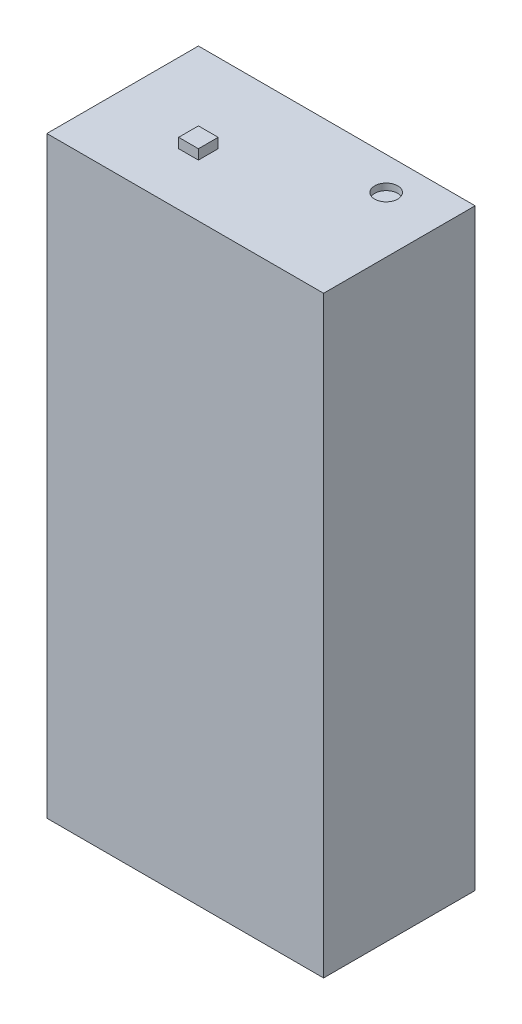
ISO-10303-21;
HEADER;
FILE_DESCRIPTION(('STEP AP214'),'2;1');
FILE_NAME('part.step','',(''),(''),'','','');
FILE_SCHEMA(('AUTOMOTIVE_DESIGN { 1 0 10303 214 1 1 1 1 }'));
ENDSEC;
DATA;
#1=APPLICATION_CONTEXT('core data for automotive mechanical design processes');
#2=APPLICATION_PROTOCOL_DEFINITION('international standard','automotive_design',2000,#1);
#3=PRODUCT_CONTEXT('',#1,'mechanical');
#4=PRODUCT('Part','Part','',(#3));
#5=PRODUCT_RELATED_PRODUCT_CATEGORY('part','',(#4));
#6=PRODUCT_DEFINITION_FORMATION('','',#4);
#7=PRODUCT_DEFINITION_CONTEXT('part definition',#1,'design');
#8=PRODUCT_DEFINITION('design','',#6,#7);
#9=PRODUCT_DEFINITION_SHAPE('','',#8);
#10=(LENGTH_UNIT() NAMED_UNIT(*) SI_UNIT(.MILLI.,.METRE.));
#11=(NAMED_UNIT(*) PLANE_ANGLE_UNIT() SI_UNIT($,.RADIAN.));
#12=(NAMED_UNIT(*) SI_UNIT($,.STERADIAN.) SOLID_ANGLE_UNIT());
#13=UNCERTAINTY_MEASURE_WITH_UNIT(LENGTH_MEASURE(1.E-05),#10,'distance_accuracy_value','');
#14=(GEOMETRIC_REPRESENTATION_CONTEXT(3) GLOBAL_UNCERTAINTY_ASSIGNED_CONTEXT((#13)) GLOBAL_UNIT_ASSIGNED_CONTEXT((#10,
#11,#12)) REPRESENTATION_CONTEXT('',''));
#15=CARTESIAN_POINT('',(0.,0.,0.));
#16=DIRECTION('',(0.,0.,1.));
#17=DIRECTION('',(1.,0.,0.));
#18=AXIS2_PLACEMENT_3D('',#15,#16,#17);
#19=CARTESIAN_POINT('',(0.,45.,23.));
#20=DIRECTION('',(0.,1.,0.));
#21=DIRECTION('',(0.,0.,1.));
#22=AXIS2_PLACEMENT_3D('',#19,#20,#21);
#23=PLANE('',#22);
#24=DIRECTION('',(0.,0.,-1.));
#25=VECTOR('',#24,1.);
#26=CARTESIAN_POINT('',(-9.,45.,0.));
#27=LINE('',#26,#25);
#28=CARTESIAN_POINT('',(-9.,45.,15.));
#29=VERTEX_POINT('',#28);
#30=CARTESIAN_POINT('',(-9.,45.,12.));
#31=VERTEX_POINT('',#30);
#32=EDGE_CURVE('E124',#29,#31,#27,.T.);
#33=ORIENTED_EDGE('',*,*,#32,.T.);
#34=DIRECTION('',(-1.,0.,0.));
#35=VECTOR('',#34,1.);
#36=CARTESIAN_POINT('',(0.,45.,12.));
#37=LINE('',#36,#35);
#38=CARTESIAN_POINT('',(-6.,45.,12.));
#39=VERTEX_POINT('',#38);
#40=EDGE_CURVE('E140',#39,#31,#37,.T.);
#41=ORIENTED_EDGE('',*,*,#40,.F.);
#42=DIRECTION('',(0.,0.,-1.));
#43=VECTOR('',#42,1.);
#44=CARTESIAN_POINT('',(-6.,45.,0.));
#45=LINE('',#44,#43);
#46=CARTESIAN_POINT('',(-6.,45.,15.));
#47=VERTEX_POINT('',#46);
#48=EDGE_CURVE('E159',#47,#39,#45,.T.);
#49=ORIENTED_EDGE('',*,*,#48,.F.);
#50=DIRECTION('',(-1.,0.,0.));
#51=VECTOR('',#50,1.);
#52=CARTESIAN_POINT('',(0.,45.,15.));
#53=LINE('',#52,#51);
#54=EDGE_CURVE('E156',#47,#29,#53,.T.);
#55=ORIENTED_EDGE('',*,*,#54,.T.);
#56=EDGE_LOOP('',(#33,#41,#49,#55));
#57=FACE_BOUND('',#56,.T.);
#58=CARTESIAN_POINT('',(12.5,45.,5.));
#59=DIRECTION('',(0.,1.,0.));
#60=DIRECTION('',(0.,0.,1.));
#61=AXIS2_PLACEMENT_3D('',#58,#59,#60);
#62=CIRCLE('',#61,1.75);
#63=CARTESIAN_POINT('',(12.5,45.,6.75));
#64=VERTEX_POINT('',#63);
#65=EDGE_CURVE('E130',#64,#64,#62,.T.);
#66=ORIENTED_EDGE('',*,*,#65,.F.);
#67=EDGE_LOOP('',(#66));
#68=FACE_BOUND('',#67,.T.);
#69=DIRECTION('',(1.,0.,0.));
#70=VECTOR('',#69,1.);
#71=CARTESIAN_POINT('',(0.,45.,0.));
#72=LINE('',#71,#70);
#73=CARTESIAN_POINT('',(-21.,45.,0.));
#74=VERTEX_POINT('',#73);
#75=CARTESIAN_POINT('',(21.,45.,0.));
#76=VERTEX_POINT('',#75);
#77=EDGE_CURVE('E205',#74,#76,#72,.T.);
#78=ORIENTED_EDGE('',*,*,#77,.F.);
#79=DIRECTION('',(0.,0.,-1.));
#80=VECTOR('',#79,1.);
#81=CARTESIAN_POINT('',(-21.,45.,23.));
#82=LINE('',#81,#80);
#83=CARTESIAN_POINT('',(-21.,45.,23.));
#84=VERTEX_POINT('',#83);
#85=EDGE_CURVE('E11',#84,#74,#82,.T.);
#86=ORIENTED_EDGE('',*,*,#85,.F.);
#87=DIRECTION('',(1.,0.,0.));
#88=VECTOR('',#87,1.);
#89=CARTESIAN_POINT('',(0.,45.,23.));
#90=LINE('',#89,#88);
#91=CARTESIAN_POINT('',(21.,45.,23.));
#92=VERTEX_POINT('',#91);
#93=EDGE_CURVE('E209',#84,#92,#90,.T.);
#94=ORIENTED_EDGE('',*,*,#93,.T.);
#95=DIRECTION('',(0.,0.,-1.));
#96=VECTOR('',#95,1.);
#97=CARTESIAN_POINT('',(21.,45.,23.));
#98=LINE('',#97,#96);
#99=EDGE_CURVE('E91',#92,#76,#98,.T.);
#100=ORIENTED_EDGE('',*,*,#99,.T.);
#101=EDGE_LOOP('',(#78,#86,#94,#100));
#102=FACE_BOUND('',#101,.T.);
#103=ADVANCED_FACE('F47',(#57,#68,#102),#23,.T.);
#104=CARTESIAN_POINT('',(-21.,0.,23.));
#105=DIRECTION('',(-1.,0.,0.));
#106=DIRECTION('',(0.,0.,1.));
#107=AXIS2_PLACEMENT_3D('',#104,#105,#106);
#108=PLANE('',#107);
#109=DIRECTION('',(0.,1.,0.));
#110=VECTOR('',#109,1.);
#111=CARTESIAN_POINT('',(-21.,0.,0.));
#112=LINE('',#111,#110);
#113=CARTESIAN_POINT('',(-21.,-45.,0.));
#114=VERTEX_POINT('',#113);
#115=EDGE_CURVE('E225',#114,#74,#112,.T.);
#116=ORIENTED_EDGE('',*,*,#115,.F.);
#117=DIRECTION('',(0.,0.,-1.));
#118=VECTOR('',#117,1.);
#119=CARTESIAN_POINT('',(-21.,-45.,23.));
#120=LINE('',#119,#118);
#121=CARTESIAN_POINT('',(-21.,-45.,23.));
#122=VERTEX_POINT('',#121);
#123=EDGE_CURVE('E55',#122,#114,#120,.T.);
#124=ORIENTED_EDGE('',*,*,#123,.F.);
#125=DIRECTION('',(0.,1.,0.));
#126=VECTOR('',#125,1.);
#127=CARTESIAN_POINT('',(-21.,0.,23.));
#128=LINE('',#127,#126);
#129=EDGE_CURVE('E212',#122,#84,#128,.T.);
#130=ORIENTED_EDGE('',*,*,#129,.T.);
#131=ORIENTED_EDGE('',*,*,#85,.T.);
#132=EDGE_LOOP('',(#116,#124,#130,#131));
#133=FACE_BOUND('',#132,.T.);
#134=ADVANCED_FACE('F251',(#133),#108,.T.);
#135=CARTESIAN_POINT('',(0.,-45.,23.));
#136=DIRECTION('',(0.,1.,0.));
#137=DIRECTION('',(0.,0.,1.));
#138=AXIS2_PLACEMENT_3D('',#135,#136,#137);
#139=PLANE('',#138);
#140=DIRECTION('',(1.,0.,0.));
#141=VECTOR('',#140,1.);
#142=CARTESIAN_POINT('',(0.,-45.,0.));
#143=LINE('',#142,#141);
#144=CARTESIAN_POINT('',(21.,-45.,0.));
#145=VERTEX_POINT('',#144);
#146=EDGE_CURVE('E229',#114,#145,#143,.T.);
#147=ORIENTED_EDGE('',*,*,#146,.T.);
#148=DIRECTION('',(0.,0.,-1.));
#149=VECTOR('',#148,1.);
#150=CARTESIAN_POINT('',(21.,-45.,23.));
#151=LINE('',#150,#149);
#152=CARTESIAN_POINT('',(21.,-45.,23.));
#153=VERTEX_POINT('',#152);
#154=EDGE_CURVE('E236',#153,#145,#151,.T.);
#155=ORIENTED_EDGE('',*,*,#154,.F.);
#156=DIRECTION('',(1.,0.,0.));
#157=VECTOR('',#156,1.);
#158=CARTESIAN_POINT('',(0.,-45.,23.));
#159=LINE('',#158,#157);
#160=EDGE_CURVE('E217',#122,#153,#159,.T.);
#161=ORIENTED_EDGE('',*,*,#160,.F.);
#162=ORIENTED_EDGE('',*,*,#123,.T.);
#163=EDGE_LOOP('',(#147,#155,#161,#162));
#164=FACE_BOUND('',#163,.T.);
#165=ADVANCED_FACE('F243',(#164),#139,.F.);
#166=CARTESIAN_POINT('',(21.,0.,23.));
#167=DIRECTION('',(-1.,0.,0.));
#168=DIRECTION('',(0.,0.,1.));
#169=AXIS2_PLACEMENT_3D('',#166,#167,#168);
#170=PLANE('',#169);
#171=DIRECTION('',(0.,1.,0.));
#172=VECTOR('',#171,1.);
#173=CARTESIAN_POINT('',(21.,0.,0.));
#174=LINE('',#173,#172);
#175=EDGE_CURVE('E213',#145,#76,#174,.T.);
#176=ORIENTED_EDGE('',*,*,#175,.T.);
#177=ORIENTED_EDGE('',*,*,#99,.F.);
#178=DIRECTION('',(0.,1.,0.));
#179=VECTOR('',#178,1.);
#180=CARTESIAN_POINT('',(21.,0.,23.));
#181=LINE('',#180,#179);
#182=EDGE_CURVE('E71',#153,#92,#181,.T.);
#183=ORIENTED_EDGE('',*,*,#182,.F.);
#184=ORIENTED_EDGE('',*,*,#154,.T.);
#185=EDGE_LOOP('',(#176,#177,#183,#184));
#186=FACE_BOUND('',#185,.T.);
#187=ADVANCED_FACE('F307',(#186),#170,.F.);
#188=CARTESIAN_POINT('',(0.,0.,23.));
#189=DIRECTION('',(0.,0.,1.));
#190=DIRECTION('',(1.,0.,0.));
#191=AXIS2_PLACEMENT_3D('',#188,#189,#190);
#192=PLANE('',#191);
#193=ORIENTED_EDGE('',*,*,#93,.F.);
#194=ORIENTED_EDGE('',*,*,#129,.F.);
#195=ORIENTED_EDGE('',*,*,#160,.T.);
#196=ORIENTED_EDGE('',*,*,#182,.T.);
#197=EDGE_LOOP('',(#193,#194,#195,#196));
#198=FACE_BOUND('',#197,.T.);
#199=ADVANCED_FACE('F304',(#198),#192,.T.);
#200=CARTESIAN_POINT('',(0.,0.,0.));
#201=DIRECTION('',(0.,0.,1.));
#202=DIRECTION('',(1.,0.,0.));
#203=AXIS2_PLACEMENT_3D('',#200,#201,#202);
#204=PLANE('',#203);
#205=CARTESIAN_POINT('',(-12.5,-25.,0.));
#206=DIRECTION('',(0.,0.,1.));
#207=DIRECTION('',(1.,0.,0.));
#208=AXIS2_PLACEMENT_3D('',#205,#206,#207);
#209=CIRCLE('',#208,2.25);
#210=CARTESIAN_POINT('',(-10.25,-25.,0.));
#211=VERTEX_POINT('',#210);
#212=EDGE_CURVE('E190',#211,#211,#209,.T.);
#213=ORIENTED_EDGE('',*,*,#212,.T.);
#214=EDGE_LOOP('',(#213));
#215=FACE_BOUND('',#214,.T.);
#216=CARTESIAN_POINT('',(11.5,20.,0.));
#217=DIRECTION('',(0.,0.,1.));
#218=DIRECTION('',(1.,0.,0.));
#219=AXIS2_PLACEMENT_3D('',#216,#217,#218);
#220=CIRCLE('',#219,2.25);
#221=CARTESIAN_POINT('',(13.75,20.,0.));
#222=VERTEX_POINT('',#221);
#223=EDGE_CURVE('E182',#222,#222,#220,.T.);
#224=ORIENTED_EDGE('',*,*,#223,.T.);
#225=EDGE_LOOP('',(#224));
#226=FACE_BOUND('',#225,.T.);
#227=CARTESIAN_POINT('',(-12.5,20.,0.));
#228=DIRECTION('',(0.,0.,1.));
#229=DIRECTION('',(1.,0.,0.));
#230=AXIS2_PLACEMENT_3D('',#227,#228,#229);
#231=CIRCLE('',#230,2.25);
#232=CARTESIAN_POINT('',(-10.25,20.,0.));
#233=VERTEX_POINT('',#232);
#234=EDGE_CURVE('E174',#233,#233,#231,.T.);
#235=ORIENTED_EDGE('',*,*,#234,.T.);
#236=EDGE_LOOP('',(#235));
#237=FACE_BOUND('',#236,.T.);
#238=CARTESIAN_POINT('',(11.5,-25.,0.));
#239=DIRECTION('',(0.,0.,1.));
#240=DIRECTION('',(1.,0.,0.));
#241=AXIS2_PLACEMENT_3D('',#238,#239,#240);
#242=CIRCLE('',#241,2.25);
#243=CARTESIAN_POINT('',(13.75,-25.,0.));
#244=VERTEX_POINT('',#243);
#245=EDGE_CURVE('E189',#244,#244,#242,.T.);
#246=ORIENTED_EDGE('',*,*,#245,.T.);
#247=EDGE_LOOP('',(#246));
#248=FACE_BOUND('',#247,.T.);
#249=ORIENTED_EDGE('',*,*,#77,.T.);
#250=ORIENTED_EDGE('',*,*,#175,.F.);
#251=ORIENTED_EDGE('',*,*,#146,.F.);
#252=ORIENTED_EDGE('',*,*,#115,.T.);
#253=EDGE_LOOP('',(#249,#250,#251,#252));
#254=FACE_BOUND('',#253,.T.);
#255=ADVANCED_FACE('F250',(#215,#226,#237,#248,#254),#204,.F.);
#256=CARTESIAN_POINT('',(11.5,-25.,1.));
#257=DIRECTION('',(0.,0.,-1.));
#258=DIRECTION('',(-1.,0.,0.));
#259=AXIS2_PLACEMENT_3D('',#256,#257,#258);
#260=CYLINDRICAL_SURFACE('',#259,2.25);
#261=CARTESIAN_POINT('',(11.5,-25.,1.));
#262=DIRECTION('',(0.,0.,1.));
#263=DIRECTION('',(1.,0.,0.));
#264=AXIS2_PLACEMENT_3D('',#261,#262,#263);
#265=CIRCLE('',#264,2.25);
#266=CARTESIAN_POINT('',(13.75,-25.,1.));
#267=VERTEX_POINT('',#266);
#268=EDGE_CURVE('E201',#267,#267,#265,.T.);
#269=ORIENTED_EDGE('',*,*,#268,.T.);
#270=EDGE_LOOP('',(#269));
#271=FACE_BOUND('',#270,.T.);
#272=ORIENTED_EDGE('',*,*,#245,.F.);
#273=EDGE_LOOP('',(#272));
#274=FACE_BOUND('',#273,.T.);
#275=ADVANCED_FACE('F299',(#271,#274),#260,.F.);
#276=CARTESIAN_POINT('',(0.,0.,1.));
#277=DIRECTION('',(0.,0.,1.));
#278=DIRECTION('',(1.,0.,0.));
#279=AXIS2_PLACEMENT_3D('',#276,#277,#278);
#280=PLANE('',#279);
#281=ORIENTED_EDGE('',*,*,#268,.F.);
#282=EDGE_LOOP('',(#281));
#283=FACE_BOUND('',#282,.T.);
#284=ADVANCED_FACE('F284',(#283),#280,.F.);
#285=CARTESIAN_POINT('',(-12.5,20.,1.));
#286=DIRECTION('',(0.,0.,-1.));
#287=DIRECTION('',(-1.,0.,0.));
#288=AXIS2_PLACEMENT_3D('',#285,#286,#287);
#289=CYLINDRICAL_SURFACE('',#288,2.25);
#290=CARTESIAN_POINT('',(-12.5,20.,1.));
#291=DIRECTION('',(0.,0.,1.));
#292=DIRECTION('',(1.,0.,0.));
#293=AXIS2_PLACEMENT_3D('',#290,#291,#292);
#294=CIRCLE('',#293,2.25);
#295=CARTESIAN_POINT('',(-10.25,20.,1.));
#296=VERTEX_POINT('',#295);
#297=EDGE_CURVE('E178',#296,#296,#294,.T.);
#298=ORIENTED_EDGE('',*,*,#297,.T.);
#299=EDGE_LOOP('',(#298));
#300=FACE_BOUND('',#299,.T.);
#301=ORIENTED_EDGE('',*,*,#234,.F.);
#302=EDGE_LOOP('',(#301));
#303=FACE_BOUND('',#302,.T.);
#304=ADVANCED_FACE('F281',(#300,#303),#289,.F.);
#305=CARTESIAN_POINT('',(0.,0.,1.));
#306=DIRECTION('',(0.,0.,1.));
#307=DIRECTION('',(1.,0.,0.));
#308=AXIS2_PLACEMENT_3D('',#305,#306,#307);
#309=PLANE('',#308);
#310=ORIENTED_EDGE('',*,*,#297,.F.);
#311=EDGE_LOOP('',(#310));
#312=FACE_BOUND('',#311,.T.);
#313=ADVANCED_FACE('F277',(#312),#309,.F.);
#314=CARTESIAN_POINT('',(11.5,20.,1.));
#315=DIRECTION('',(0.,0.,-1.));
#316=DIRECTION('',(-1.,0.,0.));
#317=AXIS2_PLACEMENT_3D('',#314,#315,#316);
#318=CYLINDRICAL_SURFACE('',#317,2.25);
#319=CARTESIAN_POINT('',(11.5,20.,1.));
#320=DIRECTION('',(0.,0.,1.));
#321=DIRECTION('',(1.,0.,0.));
#322=AXIS2_PLACEMENT_3D('',#319,#320,#321);
#323=CIRCLE('',#322,2.25);
#324=CARTESIAN_POINT('',(13.75,20.,1.));
#325=VERTEX_POINT('',#324);
#326=EDGE_CURVE('E194',#325,#325,#323,.T.);
#327=ORIENTED_EDGE('',*,*,#326,.T.);
#328=EDGE_LOOP('',(#327));
#329=FACE_BOUND('',#328,.T.);
#330=ORIENTED_EDGE('',*,*,#223,.F.);
#331=EDGE_LOOP('',(#330));
#332=FACE_BOUND('',#331,.T.);
#333=ADVANCED_FACE('F280',(#329,#332),#318,.F.);
#334=CARTESIAN_POINT('',(0.,0.,1.));
#335=DIRECTION('',(0.,0.,1.));
#336=DIRECTION('',(1.,0.,0.));
#337=AXIS2_PLACEMENT_3D('',#334,#335,#336);
#338=PLANE('',#337);
#339=ORIENTED_EDGE('',*,*,#326,.F.);
#340=EDGE_LOOP('',(#339));
#341=FACE_BOUND('',#340,.T.);
#342=ADVANCED_FACE('F289',(#341),#338,.F.);
#343=CARTESIAN_POINT('',(-12.5,-25.,1.));
#344=DIRECTION('',(0.,0.,-1.));
#345=DIRECTION('',(-1.,0.,0.));
#346=AXIS2_PLACEMENT_3D('',#343,#344,#345);
#347=CYLINDRICAL_SURFACE('',#346,2.25);
#348=CARTESIAN_POINT('',(-12.5,-25.,1.));
#349=DIRECTION('',(0.,0.,1.));
#350=DIRECTION('',(1.,0.,0.));
#351=AXIS2_PLACEMENT_3D('',#348,#349,#350);
#352=CIRCLE('',#351,2.25);
#353=CARTESIAN_POINT('',(-10.25,-25.,1.));
#354=VERTEX_POINT('',#353);
#355=EDGE_CURVE('E185',#354,#354,#352,.T.);
#356=ORIENTED_EDGE('',*,*,#355,.T.);
#357=EDGE_LOOP('',(#356));
#358=FACE_BOUND('',#357,.T.);
#359=ORIENTED_EDGE('',*,*,#212,.F.);
#360=EDGE_LOOP('',(#359));
#361=FACE_BOUND('',#360,.T.);
#362=ADVANCED_FACE('F271',(#358,#361),#347,.F.);
#363=CARTESIAN_POINT('',(0.,0.,1.));
#364=DIRECTION('',(0.,0.,1.));
#365=DIRECTION('',(1.,0.,0.));
#366=AXIS2_PLACEMENT_3D('',#363,#364,#365);
#367=PLANE('',#366);
#368=ORIENTED_EDGE('',*,*,#355,.F.);
#369=EDGE_LOOP('',(#368));
#370=FACE_BOUND('',#369,.T.);
#371=ADVANCED_FACE('F263',(#370),#367,.F.);
#372=CARTESIAN_POINT('',(12.5,44.,5.));
#373=DIRECTION('',(0.,1.,0.));
#374=DIRECTION('',(0.,0.,1.));
#375=AXIS2_PLACEMENT_3D('',#372,#373,#374);
#376=CYLINDRICAL_SURFACE('',#375,1.75);
#377=CARTESIAN_POINT('',(12.5,44.,5.));
#378=DIRECTION('',(0.,1.,0.));
#379=DIRECTION('',(0.,0.,1.));
#380=AXIS2_PLACEMENT_3D('',#377,#378,#379);
#381=CIRCLE('',#380,1.75);
#382=CARTESIAN_POINT('',(12.5,44.,6.75));
#383=VERTEX_POINT('',#382);
#384=EDGE_CURVE('E170',#383,#383,#381,.T.);
#385=ORIENTED_EDGE('',*,*,#384,.F.);
#386=EDGE_LOOP('',(#385));
#387=FACE_BOUND('',#386,.T.);
#388=ORIENTED_EDGE('',*,*,#65,.T.);
#389=EDGE_LOOP('',(#388));
#390=FACE_BOUND('',#389,.T.);
#391=ADVANCED_FACE('F260',(#387,#390),#376,.F.);
#392=CARTESIAN_POINT('',(12.5,44.,5.));
#393=DIRECTION('',(0.,1.,0.));
#394=DIRECTION('',(0.,0.,1.));
#395=AXIS2_PLACEMENT_3D('',#392,#393,#394);
#396=PLANE('',#395);
#397=ORIENTED_EDGE('',*,*,#384,.T.);
#398=EDGE_LOOP('',(#397));
#399=FACE_BOUND('',#398,.T.);
#400=ADVANCED_FACE('F262',(#399),#396,.T.);
#401=CARTESIAN_POINT('',(-9.,46.5,0.));
#402=DIRECTION('',(-1.,0.,0.));
#403=DIRECTION('',(0.,0.,1.));
#404=AXIS2_PLACEMENT_3D('',#401,#402,#403);
#405=PLANE('',#404);
#406=ORIENTED_EDGE('',*,*,#32,.F.);
#407=DIRECTION('',(0.,-1.,0.));
#408=VECTOR('',#407,1.);
#409=CARTESIAN_POINT('',(-9.,46.5,15.));
#410=LINE('',#409,#408);
#411=CARTESIAN_POINT('',(-9.,46.5,15.));
#412=VERTEX_POINT('',#411);
#413=EDGE_CURVE('E119',#412,#29,#410,.T.);
#414=ORIENTED_EDGE('',*,*,#413,.F.);
#415=DIRECTION('',(0.,0.,-1.));
#416=VECTOR('',#415,1.);
#417=CARTESIAN_POINT('',(-9.,46.5,0.));
#418=LINE('',#417,#416);
#419=CARTESIAN_POINT('',(-9.,46.5,12.));
#420=VERTEX_POINT('',#419);
#421=EDGE_CURVE('E122',#412,#420,#418,.T.);
#422=ORIENTED_EDGE('',*,*,#421,.T.);
#423=DIRECTION('',(0.,-1.,0.));
#424=VECTOR('',#423,1.);
#425=CARTESIAN_POINT('',(-9.,46.5,12.));
#426=LINE('',#425,#424);
#427=EDGE_CURVE('E153',#420,#31,#426,.T.);
#428=ORIENTED_EDGE('',*,*,#427,.T.);
#429=EDGE_LOOP('',(#406,#414,#422,#428));
#430=FACE_BOUND('',#429,.T.);
#431=ADVANCED_FACE('F121',(#430),#405,.T.);
#432=CARTESIAN_POINT('',(0.,46.5,15.));
#433=DIRECTION('',(0.,0.,1.));
#434=DIRECTION('',(1.,0.,0.));
#435=AXIS2_PLACEMENT_3D('',#432,#433,#434);
#436=PLANE('',#435);
#437=ORIENTED_EDGE('',*,*,#54,.F.);
#438=DIRECTION('',(0.,-1.,0.));
#439=VECTOR('',#438,1.);
#440=CARTESIAN_POINT('',(-6.,46.5,15.));
#441=LINE('',#440,#439);
#442=CARTESIAN_POINT('',(-6.,46.5,15.));
#443=VERTEX_POINT('',#442);
#444=EDGE_CURVE('E131',#443,#47,#441,.T.);
#445=ORIENTED_EDGE('',*,*,#444,.F.);
#446=DIRECTION('',(-1.,0.,0.));
#447=VECTOR('',#446,1.);
#448=CARTESIAN_POINT('',(0.,46.5,15.));
#449=LINE('',#448,#447);
#450=EDGE_CURVE('E136',#443,#412,#449,.T.);
#451=ORIENTED_EDGE('',*,*,#450,.T.);
#452=ORIENTED_EDGE('',*,*,#413,.T.);
#453=EDGE_LOOP('',(#437,#445,#451,#452));
#454=FACE_BOUND('',#453,.T.);
#455=ADVANCED_FACE('F142',(#454),#436,.T.);
#456=CARTESIAN_POINT('',(-6.,46.5,0.));
#457=DIRECTION('',(-1.,0.,0.));
#458=DIRECTION('',(0.,0.,1.));
#459=AXIS2_PLACEMENT_3D('',#456,#457,#458);
#460=PLANE('',#459);
#461=ORIENTED_EDGE('',*,*,#48,.T.);
#462=DIRECTION('',(0.,-1.,0.));
#463=VECTOR('',#462,1.);
#464=CARTESIAN_POINT('',(-6.,46.5,12.));
#465=LINE('',#464,#463);
#466=CARTESIAN_POINT('',(-6.,46.5,12.));
#467=VERTEX_POINT('',#466);
#468=EDGE_CURVE('E62',#467,#39,#465,.T.);
#469=ORIENTED_EDGE('',*,*,#468,.F.);
#470=DIRECTION('',(0.,0.,-1.));
#471=VECTOR('',#470,1.);
#472=CARTESIAN_POINT('',(-6.,46.5,0.));
#473=LINE('',#472,#471);
#474=EDGE_CURVE('E145',#443,#467,#473,.T.);
#475=ORIENTED_EDGE('',*,*,#474,.F.);
#476=ORIENTED_EDGE('',*,*,#444,.T.);
#477=EDGE_LOOP('',(#461,#469,#475,#476));
#478=FACE_BOUND('',#477,.T.);
#479=ADVANCED_FACE('F384',(#478),#460,.F.);
#480=CARTESIAN_POINT('',(0.,46.5,12.));
#481=DIRECTION('',(0.,0.,1.));
#482=DIRECTION('',(1.,0.,0.));
#483=AXIS2_PLACEMENT_3D('',#480,#481,#482);
#484=PLANE('',#483);
#485=ORIENTED_EDGE('',*,*,#40,.T.);
#486=ORIENTED_EDGE('',*,*,#427,.F.);
#487=DIRECTION('',(-1.,0.,0.));
#488=VECTOR('',#487,1.);
#489=CARTESIAN_POINT('',(0.,46.5,12.));
#490=LINE('',#489,#488);
#491=EDGE_CURVE('E137',#467,#420,#490,.T.);
#492=ORIENTED_EDGE('',*,*,#491,.F.);
#493=ORIENTED_EDGE('',*,*,#468,.T.);
#494=EDGE_LOOP('',(#485,#486,#492,#493));
#495=FACE_BOUND('',#494,.T.);
#496=ADVANCED_FACE('F393',(#495),#484,.F.);
#497=CARTESIAN_POINT('',(0.,46.5,0.));
#498=DIRECTION('',(0.,1.,0.));
#499=DIRECTION('',(0.,0.,1.));
#500=AXIS2_PLACEMENT_3D('',#497,#498,#499);
#501=PLANE('',#500);
#502=ORIENTED_EDGE('',*,*,#421,.F.);
#503=ORIENTED_EDGE('',*,*,#450,.F.);
#504=ORIENTED_EDGE('',*,*,#474,.T.);
#505=ORIENTED_EDGE('',*,*,#491,.T.);
#506=EDGE_LOOP('',(#502,#503,#504,#505));
#507=FACE_BOUND('',#506,.T.);
#508=ADVANCED_FACE('F135',(#507),#501,.T.);
#509=CLOSED_SHELL('',(#103,#134,#165,#187,#199,#255,#275,#284,#304,#313,#333,#342,#362,#371,
#391,#400,#431,#455,#479,#496,#508));
#510=MANIFOLD_SOLID_BREP('B2',#509);
#511=ADVANCED_BREP_SHAPE_REPRESENTATION('',(#18,#510),#14);
#512=SHAPE_DEFINITION_REPRESENTATION(#9,#511);
ENDSEC;
END-ISO-10303-21;
